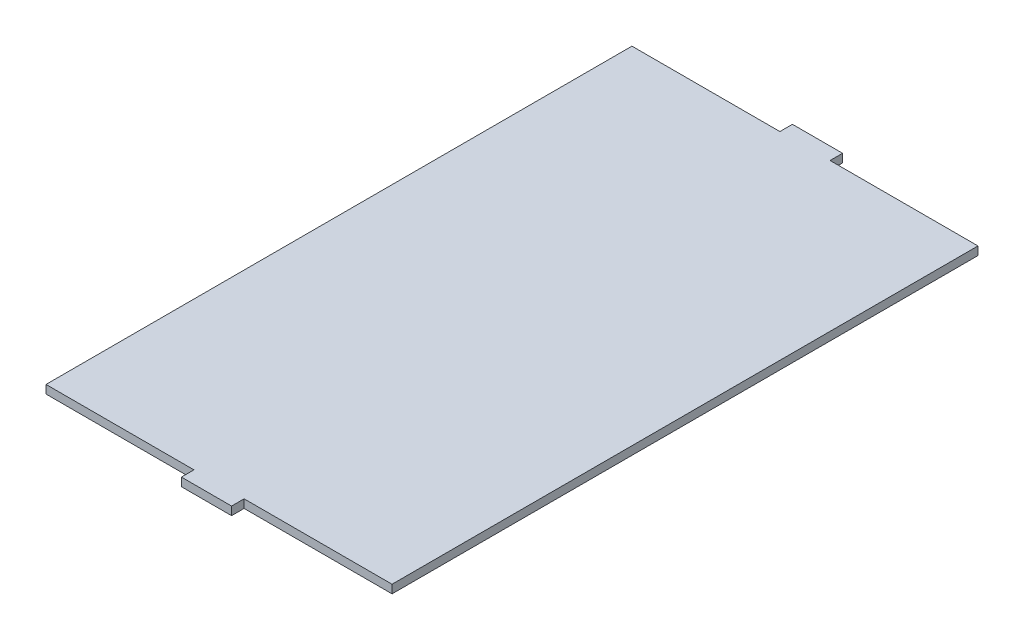
ISO-10303-21;
HEADER;
FILE_DESCRIPTION(('STEP AP214'),'2;1');
FILE_NAME('part.step','',(''),(''),'','','');
FILE_SCHEMA(('AUTOMOTIVE_DESIGN { 1 0 10303 214 1 1 1 1 }'));
ENDSEC;
DATA;
#1=APPLICATION_CONTEXT('core data for automotive mechanical design processes');
#2=APPLICATION_PROTOCOL_DEFINITION('international standard','automotive_design',2000,#1);
#3=PRODUCT_CONTEXT('',#1,'mechanical');
#4=PRODUCT('Part','Part','',(#3));
#5=PRODUCT_RELATED_PRODUCT_CATEGORY('part','',(#4));
#6=PRODUCT_DEFINITION_FORMATION('','',#4);
#7=PRODUCT_DEFINITION_CONTEXT('part definition',#1,'design');
#8=PRODUCT_DEFINITION('design','',#6,#7);
#9=PRODUCT_DEFINITION_SHAPE('','',#8);
#10=(LENGTH_UNIT() NAMED_UNIT(*) SI_UNIT(.MILLI.,.METRE.));
#11=(NAMED_UNIT(*) PLANE_ANGLE_UNIT() SI_UNIT($,.RADIAN.));
#12=(NAMED_UNIT(*) SI_UNIT($,.STERADIAN.) SOLID_ANGLE_UNIT());
#13=UNCERTAINTY_MEASURE_WITH_UNIT(LENGTH_MEASURE(1.E-05),#10,'distance_accuracy_value','');
#14=(GEOMETRIC_REPRESENTATION_CONTEXT(3) GLOBAL_UNCERTAINTY_ASSIGNED_CONTEXT((#13)) GLOBAL_UNIT_ASSIGNED_CONTEXT((#10,
#11,#12)) REPRESENTATION_CONTEXT('',''));
#15=CARTESIAN_POINT('',(0.,0.,0.));
#16=DIRECTION('',(0.,0.,1.));
#17=DIRECTION('',(1.,0.,0.));
#18=AXIS2_PLACEMENT_3D('',#15,#16,#17);
#19=CARTESIAN_POINT('',(-0.299999999999988,9.600934471831,-3.655));
#20=DIRECTION('',(1.,0.,0.));
#21=DIRECTION('',(0.,0.,-1.));
#22=AXIS2_PLACEMENT_3D('',#19,#20,#21);
#23=PLANE('',#22);
#24=DIRECTION('',(0.,0.,1.));
#25=VECTOR('',#24,1.);
#26=CARTESIAN_POINT('',(-0.299999999999988,1.2,-3.655));
#27=LINE('',#26,#25);
#28=CARTESIAN_POINT('',(-0.299999999999988,1.2,-3.655));
#29=VERTEX_POINT('',#28);
#30=CARTESIAN_POINT('',(-0.299999999999987,1.2,-3.505));
#31=VERTEX_POINT('',#30);
#32=EDGE_CURVE('E11',#29,#31,#27,.T.);
#33=ORIENTED_EDGE('',*,*,#32,.F.);
#34=DIRECTION('',(0.,-1.,0.));
#35=VECTOR('',#34,1.);
#36=CARTESIAN_POINT('',(-0.299999999999988,9.600934471831,-3.655));
#37=LINE('',#36,#35);
#38=CARTESIAN_POINT('',(-0.299999999999988,1.1,-3.655));
#39=VERTEX_POINT('',#38);
#40=EDGE_CURVE('E24',#29,#39,#37,.T.);
#41=ORIENTED_EDGE('',*,*,#40,.T.);
#42=DIRECTION('',(0.,0.,1.));
#43=VECTOR('',#42,1.);
#44=CARTESIAN_POINT('',(-0.299999999999988,1.1,-3.655));
#45=LINE('',#44,#43);
#46=CARTESIAN_POINT('',(-0.299999999999987,1.1,-3.505));
#47=VERTEX_POINT('',#46);
#48=EDGE_CURVE('E124',#39,#47,#45,.T.);
#49=ORIENTED_EDGE('',*,*,#48,.T.);
#50=DIRECTION('',(0.,-1.,0.));
#51=VECTOR('',#50,1.);
#52=CARTESIAN_POINT('',(-0.299999999999987,9.600934471831,-3.505));
#53=LINE('',#52,#51);
#54=EDGE_CURVE('E190',#31,#47,#53,.T.);
#55=ORIENTED_EDGE('',*,*,#54,.F.);
#56=EDGE_LOOP('',(#33,#41,#49,#55));
#57=FACE_BOUND('',#56,.T.);
#58=ADVANCED_FACE('F17',(#57),#23,.F.);
#59=CARTESIAN_POINT('',(-0.299999999999987,9.600934471831,-3.505));
#60=DIRECTION('',(0.,0.,1.));
#61=DIRECTION('',(1.,0.,0.));
#62=AXIS2_PLACEMENT_3D('',#59,#60,#61);
#63=PLANE('',#62);
#64=DIRECTION('',(-1.,0.,0.));
#65=VECTOR('',#64,1.);
#66=CARTESIAN_POINT('',(-0.299999999999987,1.2,-3.505));
#67=LINE('',#66,#65);
#68=CARTESIAN_POINT('',(-2.07,1.2,-3.505));
#69=VERTEX_POINT('',#68);
#70=EDGE_CURVE('E188',#31,#69,#67,.T.);
#71=ORIENTED_EDGE('',*,*,#70,.F.);
#72=ORIENTED_EDGE('',*,*,#54,.T.);
#73=DIRECTION('',(-1.,0.,0.));
#74=VECTOR('',#73,1.);
#75=CARTESIAN_POINT('',(-0.299999999999987,1.1,-3.505));
#76=LINE('',#75,#74);
#77=CARTESIAN_POINT('',(-2.07,1.1,-3.505));
#78=VERTEX_POINT('',#77);
#79=EDGE_CURVE('E186',#47,#78,#76,.T.);
#80=ORIENTED_EDGE('',*,*,#79,.T.);
#81=DIRECTION('',(0.,-1.,0.));
#82=VECTOR('',#81,1.);
#83=CARTESIAN_POINT('',(-2.07,9.600934471831,-3.505));
#84=LINE('',#83,#82);
#85=EDGE_CURVE('E183',#69,#78,#84,.T.);
#86=ORIENTED_EDGE('',*,*,#85,.F.);
#87=EDGE_LOOP('',(#71,#72,#80,#86));
#88=FACE_BOUND('',#87,.T.);
#89=ADVANCED_FACE('F235',(#88),#63,.F.);
#90=CARTESIAN_POINT('',(-2.07,9.600934471831,-3.505));
#91=DIRECTION('',(1.,0.,0.));
#92=DIRECTION('',(0.,0.,-1.));
#93=AXIS2_PLACEMENT_3D('',#90,#91,#92);
#94=PLANE('',#93);
#95=DIRECTION('',(0.,0.,1.));
#96=VECTOR('',#95,1.);
#97=CARTESIAN_POINT('',(-2.07,1.2,-3.505));
#98=LINE('',#97,#96);
#99=CARTESIAN_POINT('',(-2.07,1.2,3.505));
#100=VERTEX_POINT('',#99);
#101=EDGE_CURVE('E181',#69,#100,#98,.T.);
#102=ORIENTED_EDGE('',*,*,#101,.F.);
#103=ORIENTED_EDGE('',*,*,#85,.T.);
#104=DIRECTION('',(0.,0.,1.));
#105=VECTOR('',#104,1.);
#106=CARTESIAN_POINT('',(-2.07,1.1,-3.505));
#107=LINE('',#106,#105);
#108=CARTESIAN_POINT('',(-2.07,1.1,3.505));
#109=VERTEX_POINT('',#108);
#110=EDGE_CURVE('E179',#78,#109,#107,.T.);
#111=ORIENTED_EDGE('',*,*,#110,.T.);
#112=DIRECTION('',(0.,-1.,0.));
#113=VECTOR('',#112,1.);
#114=CARTESIAN_POINT('',(-2.07,9.600934471831,3.505));
#115=LINE('',#114,#113);
#116=EDGE_CURVE('E176',#100,#109,#115,.T.);
#117=ORIENTED_EDGE('',*,*,#116,.F.);
#118=EDGE_LOOP('',(#102,#103,#111,#117));
#119=FACE_BOUND('',#118,.T.);
#120=ADVANCED_FACE('F231',(#119),#94,.F.);
#121=CARTESIAN_POINT('',(-2.07,9.600934471831,3.505));
#122=DIRECTION('',(0.,0.,-1.));
#123=DIRECTION('',(-1.,0.,0.));
#124=AXIS2_PLACEMENT_3D('',#121,#122,#123);
#125=PLANE('',#124);
#126=DIRECTION('',(1.,0.,0.));
#127=VECTOR('',#126,1.);
#128=CARTESIAN_POINT('',(-2.07,1.2,3.505));
#129=LINE('',#128,#127);
#130=CARTESIAN_POINT('',(-0.300000000000011,1.2,3.505));
#131=VERTEX_POINT('',#130);
#132=EDGE_CURVE('E174',#100,#131,#129,.T.);
#133=ORIENTED_EDGE('',*,*,#132,.F.);
#134=ORIENTED_EDGE('',*,*,#116,.T.);
#135=DIRECTION('',(1.,0.,0.));
#136=VECTOR('',#135,1.);
#137=CARTESIAN_POINT('',(-2.07,1.1,3.505));
#138=LINE('',#137,#136);
#139=CARTESIAN_POINT('',(-0.300000000000011,1.1,3.505));
#140=VERTEX_POINT('',#139);
#141=EDGE_CURVE('E172',#109,#140,#138,.T.);
#142=ORIENTED_EDGE('',*,*,#141,.T.);
#143=DIRECTION('',(0.,-1.,0.));
#144=VECTOR('',#143,1.);
#145=CARTESIAN_POINT('',(-0.300000000000011,9.600934471831,3.505));
#146=LINE('',#145,#144);
#147=EDGE_CURVE('E169',#131,#140,#146,.T.);
#148=ORIENTED_EDGE('',*,*,#147,.F.);
#149=EDGE_LOOP('',(#133,#134,#142,#148));
#150=FACE_BOUND('',#149,.T.);
#151=ADVANCED_FACE('F226',(#150),#125,.F.);
#152=CARTESIAN_POINT('',(-0.300000000000011,9.600934471831,3.505));
#153=DIRECTION('',(1.,0.,0.));
#154=DIRECTION('',(0.,0.,-1.));
#155=AXIS2_PLACEMENT_3D('',#152,#153,#154);
#156=PLANE('',#155);
#157=DIRECTION('',(0.,0.,1.));
#158=VECTOR('',#157,1.);
#159=CARTESIAN_POINT('',(-0.300000000000011,1.2,3.505));
#160=LINE('',#159,#158);
#161=CARTESIAN_POINT('',(-0.300000000000013,1.2,3.655));
#162=VERTEX_POINT('',#161);
#163=EDGE_CURVE('E167',#131,#162,#160,.T.);
#164=ORIENTED_EDGE('',*,*,#163,.F.);
#165=ORIENTED_EDGE('',*,*,#147,.T.);
#166=DIRECTION('',(0.,0.,1.));
#167=VECTOR('',#166,1.);
#168=CARTESIAN_POINT('',(-0.300000000000011,1.1,3.505));
#169=LINE('',#168,#167);
#170=CARTESIAN_POINT('',(-0.300000000000013,1.1,3.655));
#171=VERTEX_POINT('',#170);
#172=EDGE_CURVE('E165',#140,#171,#169,.T.);
#173=ORIENTED_EDGE('',*,*,#172,.T.);
#174=DIRECTION('',(0.,-1.,0.));
#175=VECTOR('',#174,1.);
#176=CARTESIAN_POINT('',(-0.300000000000013,9.600934471831,3.655));
#177=LINE('',#176,#175);
#178=EDGE_CURVE('E162',#162,#171,#177,.T.);
#179=ORIENTED_EDGE('',*,*,#178,.F.);
#180=EDGE_LOOP('',(#164,#165,#173,#179));
#181=FACE_BOUND('',#180,.T.);
#182=ADVANCED_FACE('F222',(#181),#156,.F.);
#183=CARTESIAN_POINT('',(-0.300000000000013,9.600934471831,3.655));
#184=DIRECTION('',(0.,0.,-1.));
#185=DIRECTION('',(-1.,0.,0.));
#186=AXIS2_PLACEMENT_3D('',#183,#184,#185);
#187=PLANE('',#186);
#188=DIRECTION('',(1.,0.,0.));
#189=VECTOR('',#188,1.);
#190=CARTESIAN_POINT('',(-0.300000000000013,1.2,3.655));
#191=LINE('',#190,#189);
#192=CARTESIAN_POINT('',(0.299999999999987,1.2,3.655));
#193=VERTEX_POINT('',#192);
#194=EDGE_CURVE('E160',#162,#193,#191,.T.);
#195=ORIENTED_EDGE('',*,*,#194,.F.);
#196=ORIENTED_EDGE('',*,*,#178,.T.);
#197=DIRECTION('',(1.,0.,0.));
#198=VECTOR('',#197,1.);
#199=CARTESIAN_POINT('',(-0.300000000000013,1.1,3.655));
#200=LINE('',#199,#198);
#201=CARTESIAN_POINT('',(0.299999999999987,1.1,3.655));
#202=VERTEX_POINT('',#201);
#203=EDGE_CURVE('E158',#171,#202,#200,.T.);
#204=ORIENTED_EDGE('',*,*,#203,.T.);
#205=DIRECTION('',(0.,-1.,0.));
#206=VECTOR('',#205,1.);
#207=CARTESIAN_POINT('',(0.299999999999987,9.600934471831,3.655));
#208=LINE('',#207,#206);
#209=EDGE_CURVE('E155',#193,#202,#208,.T.);
#210=ORIENTED_EDGE('',*,*,#209,.F.);
#211=EDGE_LOOP('',(#195,#196,#204,#210));
#212=FACE_BOUND('',#211,.T.);
#213=ADVANCED_FACE('F218',(#212),#187,.F.);
#214=CARTESIAN_POINT('',(0.299999999999987,9.600934471831,3.655));
#215=DIRECTION('',(-1.,0.,0.));
#216=DIRECTION('',(0.,0.,1.));
#217=AXIS2_PLACEMENT_3D('',#214,#215,#216);
#218=PLANE('',#217);
#219=DIRECTION('',(0.,0.,-1.));
#220=VECTOR('',#219,1.);
#221=CARTESIAN_POINT('',(0.299999999999987,1.2,3.655));
#222=LINE('',#221,#220);
#223=CARTESIAN_POINT('',(0.299999999999988,1.2,3.505));
#224=VERTEX_POINT('',#223);
#225=EDGE_CURVE('E153',#193,#224,#222,.T.);
#226=ORIENTED_EDGE('',*,*,#225,.F.);
#227=ORIENTED_EDGE('',*,*,#209,.T.);
#228=DIRECTION('',(0.,0.,-1.));
#229=VECTOR('',#228,1.);
#230=CARTESIAN_POINT('',(0.299999999999987,1.1,3.655));
#231=LINE('',#230,#229);
#232=CARTESIAN_POINT('',(0.299999999999988,1.1,3.505));
#233=VERTEX_POINT('',#232);
#234=EDGE_CURVE('E151',#202,#233,#231,.T.);
#235=ORIENTED_EDGE('',*,*,#234,.T.);
#236=DIRECTION('',(0.,-1.,0.));
#237=VECTOR('',#236,1.);
#238=CARTESIAN_POINT('',(0.299999999999988,9.600934471831,3.505));
#239=LINE('',#238,#237);
#240=EDGE_CURVE('E148',#224,#233,#239,.T.);
#241=ORIENTED_EDGE('',*,*,#240,.F.);
#242=EDGE_LOOP('',(#226,#227,#235,#241));
#243=FACE_BOUND('',#242,.T.);
#244=ADVANCED_FACE('F211',(#243),#218,.F.);
#245=CARTESIAN_POINT('',(0.299999999999988,9.600934471831,3.505));
#246=DIRECTION('',(0.,0.,-1.));
#247=DIRECTION('',(-1.,0.,0.));
#248=AXIS2_PLACEMENT_3D('',#245,#246,#247);
#249=PLANE('',#248);
#250=DIRECTION('',(1.,0.,0.));
#251=VECTOR('',#250,1.);
#252=CARTESIAN_POINT('',(0.299999999999988,1.2,3.505));
#253=LINE('',#252,#251);
#254=CARTESIAN_POINT('',(2.07,1.2,3.505));
#255=VERTEX_POINT('',#254);
#256=EDGE_CURVE('E146',#224,#255,#253,.T.);
#257=ORIENTED_EDGE('',*,*,#256,.F.);
#258=ORIENTED_EDGE('',*,*,#240,.T.);
#259=DIRECTION('',(1.,0.,0.));
#260=VECTOR('',#259,1.);
#261=CARTESIAN_POINT('',(0.299999999999988,1.1,3.505));
#262=LINE('',#261,#260);
#263=CARTESIAN_POINT('',(2.07,1.1,3.505));
#264=VERTEX_POINT('',#263);
#265=EDGE_CURVE('E144',#233,#264,#262,.T.);
#266=ORIENTED_EDGE('',*,*,#265,.T.);
#267=DIRECTION('',(0.,-1.,0.));
#268=VECTOR('',#267,1.);
#269=CARTESIAN_POINT('',(2.07,9.600934471831,3.505));
#270=LINE('',#269,#268);
#271=EDGE_CURVE('E141',#255,#264,#270,.T.);
#272=ORIENTED_EDGE('',*,*,#271,.F.);
#273=EDGE_LOOP('',(#257,#258,#266,#272));
#274=FACE_BOUND('',#273,.T.);
#275=ADVANCED_FACE('F207',(#274),#249,.F.);
#276=CARTESIAN_POINT('',(2.07,9.600934471831,3.505));
#277=DIRECTION('',(-1.,0.,0.));
#278=DIRECTION('',(0.,0.,1.));
#279=AXIS2_PLACEMENT_3D('',#276,#277,#278);
#280=PLANE('',#279);
#281=DIRECTION('',(0.,0.,-1.));
#282=VECTOR('',#281,1.);
#283=CARTESIAN_POINT('',(2.07,1.2,3.505));
#284=LINE('',#283,#282);
#285=CARTESIAN_POINT('',(2.07,1.2,-3.505));
#286=VERTEX_POINT('',#285);
#287=EDGE_CURVE('E139',#255,#286,#284,.T.);
#288=ORIENTED_EDGE('',*,*,#287,.F.);
#289=ORIENTED_EDGE('',*,*,#271,.T.);
#290=DIRECTION('',(0.,0.,-1.));
#291=VECTOR('',#290,1.);
#292=CARTESIAN_POINT('',(2.07,1.1,3.505));
#293=LINE('',#292,#291);
#294=CARTESIAN_POINT('',(2.07,1.1,-3.505));
#295=VERTEX_POINT('',#294);
#296=EDGE_CURVE('E137',#264,#295,#293,.T.);
#297=ORIENTED_EDGE('',*,*,#296,.T.);
#298=DIRECTION('',(0.,-1.,0.));
#299=VECTOR('',#298,1.);
#300=CARTESIAN_POINT('',(2.07,9.600934471831,-3.505));
#301=LINE('',#300,#299);
#302=EDGE_CURVE('E134',#286,#295,#301,.T.);
#303=ORIENTED_EDGE('',*,*,#302,.F.);
#304=EDGE_LOOP('',(#288,#289,#297,#303));
#305=FACE_BOUND('',#304,.T.);
#306=ADVANCED_FACE('F203',(#305),#280,.F.);
#307=CARTESIAN_POINT('',(2.07,9.600934471831,-3.505));
#308=DIRECTION('',(0.,0.,1.));
#309=DIRECTION('',(1.,0.,0.));
#310=AXIS2_PLACEMENT_3D('',#307,#308,#309);
#311=PLANE('',#310);
#312=DIRECTION('',(-1.,0.,0.));
#313=VECTOR('',#312,1.);
#314=CARTESIAN_POINT('',(2.07,1.2,-3.505));
#315=LINE('',#314,#313);
#316=CARTESIAN_POINT('',(0.300000000000012,1.2,-3.505));
#317=VERTEX_POINT('',#316);
#318=EDGE_CURVE('E132',#286,#317,#315,.T.);
#319=ORIENTED_EDGE('',*,*,#318,.F.);
#320=ORIENTED_EDGE('',*,*,#302,.T.);
#321=DIRECTION('',(-1.,0.,0.));
#322=VECTOR('',#321,1.);
#323=CARTESIAN_POINT('',(2.07,1.1,-3.505));
#324=LINE('',#323,#322);
#325=CARTESIAN_POINT('',(0.300000000000012,1.1,-3.505));
#326=VERTEX_POINT('',#325);
#327=EDGE_CURVE('E130',#295,#326,#324,.T.);
#328=ORIENTED_EDGE('',*,*,#327,.T.);
#329=DIRECTION('',(0.,-1.,0.));
#330=VECTOR('',#329,1.);
#331=CARTESIAN_POINT('',(0.300000000000012,9.600934471831,-3.505));
#332=LINE('',#331,#330);
#333=EDGE_CURVE('E109',#317,#326,#332,.T.);
#334=ORIENTED_EDGE('',*,*,#333,.F.);
#335=EDGE_LOOP('',(#319,#320,#328,#334));
#336=FACE_BOUND('',#335,.T.);
#337=ADVANCED_FACE('F198',(#336),#311,.F.);
#338=CARTESIAN_POINT('',(0.300000000000012,9.600934471831,-3.505));
#339=DIRECTION('',(-1.,0.,0.));
#340=DIRECTION('',(0.,0.,1.));
#341=AXIS2_PLACEMENT_3D('',#338,#339,#340);
#342=PLANE('',#341);
#343=DIRECTION('',(0.,0.,-1.));
#344=VECTOR('',#343,1.);
#345=CARTESIAN_POINT('',(0.300000000000012,1.2,-3.505));
#346=LINE('',#345,#344);
#347=CARTESIAN_POINT('',(0.300000000000012,1.2,-3.655));
#348=VERTEX_POINT('',#347);
#349=EDGE_CURVE('E113',#317,#348,#346,.T.);
#350=ORIENTED_EDGE('',*,*,#349,.F.);
#351=ORIENTED_EDGE('',*,*,#333,.T.);
#352=DIRECTION('',(0.,0.,-1.));
#353=VECTOR('',#352,1.);
#354=CARTESIAN_POINT('',(0.300000000000012,1.1,-3.505));
#355=LINE('',#354,#353);
#356=CARTESIAN_POINT('',(0.300000000000012,1.1,-3.655));
#357=VERTEX_POINT('',#356);
#358=EDGE_CURVE('E102',#326,#357,#355,.T.);
#359=ORIENTED_EDGE('',*,*,#358,.T.);
#360=DIRECTION('',(0.,-1.,0.));
#361=VECTOR('',#360,1.);
#362=CARTESIAN_POINT('',(0.300000000000012,9.600934471831,-3.655));
#363=LINE('',#362,#361);
#364=EDGE_CURVE('E106',#348,#357,#363,.T.);
#365=ORIENTED_EDGE('',*,*,#364,.F.);
#366=EDGE_LOOP('',(#350,#351,#359,#365));
#367=FACE_BOUND('',#366,.T.);
#368=ADVANCED_FACE('F105',(#367),#342,.F.);
#369=CARTESIAN_POINT('',(0.300000000000012,9.600934471831,-3.655));
#370=DIRECTION('',(0.,0.,1.));
#371=DIRECTION('',(1.,0.,0.));
#372=AXIS2_PLACEMENT_3D('',#369,#370,#371);
#373=PLANE('',#372);
#374=DIRECTION('',(-1.,0.,0.));
#375=VECTOR('',#374,1.);
#376=CARTESIAN_POINT('',(0.300000000000012,1.2,-3.655));
#377=LINE('',#376,#375);
#378=EDGE_CURVE('E119',#348,#29,#377,.T.);
#379=ORIENTED_EDGE('',*,*,#378,.F.);
#380=ORIENTED_EDGE('',*,*,#364,.T.);
#381=DIRECTION('',(-1.,0.,0.));
#382=VECTOR('',#381,1.);
#383=CARTESIAN_POINT('',(0.300000000000012,1.1,-3.655));
#384=LINE('',#383,#382);
#385=EDGE_CURVE('E118',#357,#39,#384,.T.);
#386=ORIENTED_EDGE('',*,*,#385,.T.);
#387=ORIENTED_EDGE('',*,*,#40,.F.);
#388=EDGE_LOOP('',(#379,#380,#386,#387));
#389=FACE_BOUND('',#388,.T.);
#390=ADVANCED_FACE('F117',(#389),#373,.F.);
#391=CARTESIAN_POINT('',(0.,1.1,0.));
#392=DIRECTION('',(0.,-1.,0.));
#393=DIRECTION('',(1.,0.,0.));
#394=AXIS2_PLACEMENT_3D('',#391,#392,#393);
#395=PLANE('',#394);
#396=ORIENTED_EDGE('',*,*,#48,.F.);
#397=ORIENTED_EDGE('',*,*,#385,.F.);
#398=ORIENTED_EDGE('',*,*,#358,.F.);
#399=ORIENTED_EDGE('',*,*,#327,.F.);
#400=ORIENTED_EDGE('',*,*,#296,.F.);
#401=ORIENTED_EDGE('',*,*,#265,.F.);
#402=ORIENTED_EDGE('',*,*,#234,.F.);
#403=ORIENTED_EDGE('',*,*,#203,.F.);
#404=ORIENTED_EDGE('',*,*,#172,.F.);
#405=ORIENTED_EDGE('',*,*,#141,.F.);
#406=ORIENTED_EDGE('',*,*,#110,.F.);
#407=ORIENTED_EDGE('',*,*,#79,.F.);
#408=EDGE_LOOP('',(#396,#397,#398,#399,#400,#401,#402,#403,#404,#405,#406,#407));
#409=FACE_BOUND('',#408,.T.);
#410=ADVANCED_FACE('F122',(#409),#395,.T.);
#411=CARTESIAN_POINT('',(0.,1.2,0.));
#412=DIRECTION('',(0.,1.,0.));
#413=DIRECTION('',(-1.,0.,0.));
#414=AXIS2_PLACEMENT_3D('',#411,#412,#413);
#415=PLANE('',#414);
#416=ORIENTED_EDGE('',*,*,#378,.T.);
#417=ORIENTED_EDGE('',*,*,#32,.T.);
#418=ORIENTED_EDGE('',*,*,#70,.T.);
#419=ORIENTED_EDGE('',*,*,#101,.T.);
#420=ORIENTED_EDGE('',*,*,#132,.T.);
#421=ORIENTED_EDGE('',*,*,#163,.T.);
#422=ORIENTED_EDGE('',*,*,#194,.T.);
#423=ORIENTED_EDGE('',*,*,#225,.T.);
#424=ORIENTED_EDGE('',*,*,#256,.T.);
#425=ORIENTED_EDGE('',*,*,#287,.T.);
#426=ORIENTED_EDGE('',*,*,#318,.T.);
#427=ORIENTED_EDGE('',*,*,#349,.T.);
#428=EDGE_LOOP('',(#416,#417,#418,#419,#420,#421,#422,#423,#424,#425,#426,#427));
#429=FACE_BOUND('',#428,.T.);
#430=ADVANCED_FACE('F193',(#429),#415,.T.);
#431=CLOSED_SHELL('',(#58,#89,#120,#151,#182,#213,#244,#275,#306,#337,#368,#390,#410,#430));
#432=MANIFOLD_SOLID_BREP('B1',#431);
#433=ADVANCED_BREP_SHAPE_REPRESENTATION('',(#18,#432),#14);
#434=SHAPE_DEFINITION_REPRESENTATION(#9,#433);
ENDSEC;
END-ISO-10303-21;
